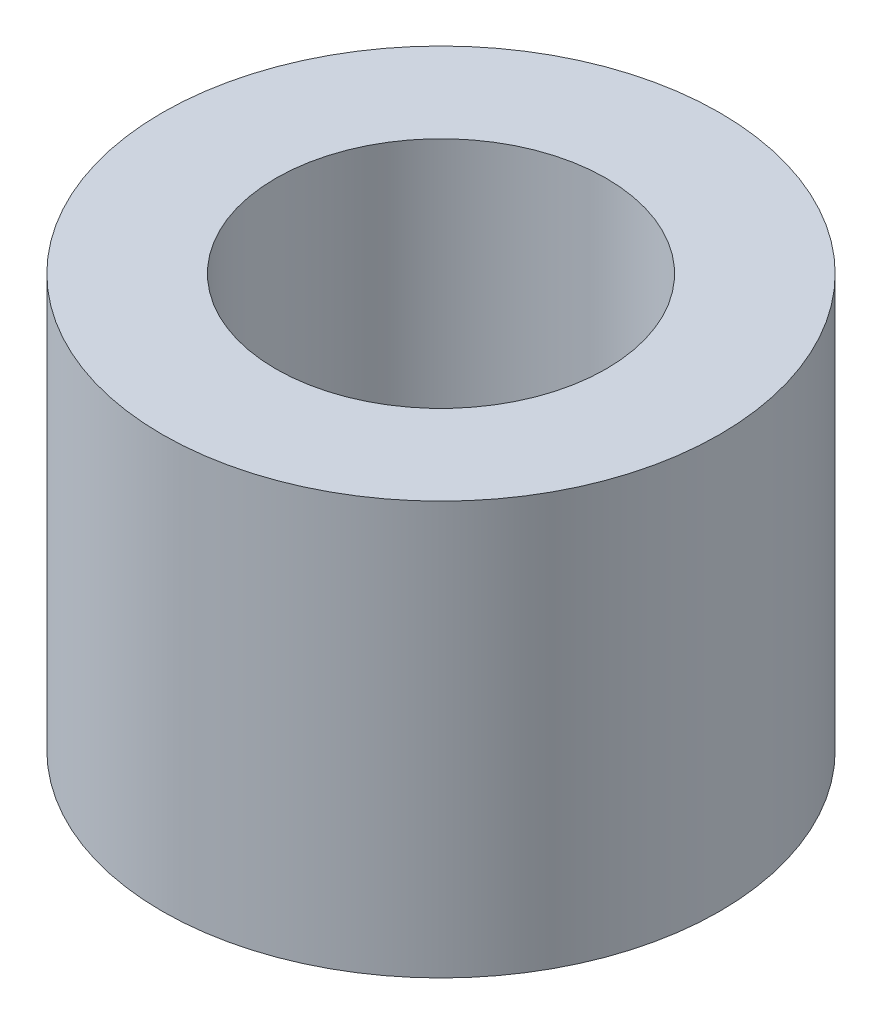
ISO-10303-21;
HEADER;
FILE_DESCRIPTION(('STEP AP214'),'2;1');
FILE_NAME('part.step','',(''),(''),'','','');
FILE_SCHEMA(('AUTOMOTIVE_DESIGN { 1 0 10303 214 1 1 1 1 }'));
ENDSEC;
DATA;
#1=APPLICATION_CONTEXT('core data for automotive mechanical design processes');
#2=APPLICATION_PROTOCOL_DEFINITION('international standard','automotive_design',2000,#1);
#3=PRODUCT_CONTEXT('',#1,'mechanical');
#4=PRODUCT('Part','Part','',(#3));
#5=PRODUCT_RELATED_PRODUCT_CATEGORY('part','',(#4));
#6=PRODUCT_DEFINITION_FORMATION('','',#4);
#7=PRODUCT_DEFINITION_CONTEXT('part definition',#1,'design');
#8=PRODUCT_DEFINITION('design','',#6,#7);
#9=PRODUCT_DEFINITION_SHAPE('','',#8);
#10=(LENGTH_UNIT() NAMED_UNIT(*) SI_UNIT(.MILLI.,.METRE.));
#11=(NAMED_UNIT(*) PLANE_ANGLE_UNIT() SI_UNIT($,.RADIAN.));
#12=(NAMED_UNIT(*) SI_UNIT($,.STERADIAN.) SOLID_ANGLE_UNIT());
#13=UNCERTAINTY_MEASURE_WITH_UNIT(LENGTH_MEASURE(1.E-05),#10,'distance_accuracy_value','');
#14=(GEOMETRIC_REPRESENTATION_CONTEXT(3) GLOBAL_UNCERTAINTY_ASSIGNED_CONTEXT((#13)) GLOBAL_UNIT_ASSIGNED_CONTEXT((#10,
#11,#12)) REPRESENTATION_CONTEXT('',''));
#15=CARTESIAN_POINT('',(0.,0.,0.));
#16=DIRECTION('',(0.,0.,1.));
#17=DIRECTION('',(1.,0.,0.));
#18=AXIS2_PLACEMENT_3D('',#15,#16,#17);
#19=CARTESIAN_POINT('',(0.,4.,0.));
#20=DIRECTION('',(0.,1.,0.));
#21=DIRECTION('',(0.,0.,1.));
#22=AXIS2_PLACEMENT_3D('',#19,#20,#21);
#23=PLANE('',#22);
#24=CARTESIAN_POINT('',(0.,4.,0.));
#25=DIRECTION('',(0.,1.,0.));
#26=DIRECTION('',(0.,0.,1.));
#27=AXIS2_PLACEMENT_3D('',#24,#25,#26);
#28=CIRCLE('',#27,2.7);
#29=CARTESIAN_POINT('',(0.,4.,2.7));
#30=VERTEX_POINT('',#29);
#31=EDGE_CURVE('E10',#30,#30,#28,.T.);
#32=ORIENTED_EDGE('',*,*,#31,.T.);
#33=EDGE_LOOP('',(#32));
#34=FACE_BOUND('',#33,.T.);
#35=CARTESIAN_POINT('',(0.,4.,0.));
#36=DIRECTION('',(0.,1.,0.));
#37=DIRECTION('',(0.,0.,1.));
#38=AXIS2_PLACEMENT_3D('',#35,#36,#37);
#39=CIRCLE('',#38,1.6);
#40=CARTESIAN_POINT('',(0.,4.,1.6));
#41=VERTEX_POINT('',#40);
#42=EDGE_CURVE('E47',#41,#41,#39,.T.);
#43=ORIENTED_EDGE('',*,*,#42,.F.);
#44=EDGE_LOOP('',(#43));
#45=FACE_BOUND('',#44,.T.);
#46=ADVANCED_FACE('F36',(#34,#45),#23,.T.);
#47=CARTESIAN_POINT('',(0.,0.,0.));
#48=DIRECTION('',(0.,1.,0.));
#49=DIRECTION('',(0.,0.,1.));
#50=AXIS2_PLACEMENT_3D('',#47,#48,#49);
#51=PLANE('',#50);
#52=CARTESIAN_POINT('',(0.,0.,0.));
#53=DIRECTION('',(0.,1.,0.));
#54=DIRECTION('',(0.,0.,1.));
#55=AXIS2_PLACEMENT_3D('',#52,#53,#54);
#56=CIRCLE('',#55,2.7);
#57=CARTESIAN_POINT('',(0.,0.,2.7));
#58=VERTEX_POINT('',#57);
#59=EDGE_CURVE('E40',#58,#58,#56,.T.);
#60=ORIENTED_EDGE('',*,*,#59,.F.);
#61=EDGE_LOOP('',(#60));
#62=FACE_BOUND('',#61,.T.);
#63=CARTESIAN_POINT('',(0.,0.,0.));
#64=DIRECTION('',(0.,1.,0.));
#65=DIRECTION('',(0.,0.,1.));
#66=AXIS2_PLACEMENT_3D('',#63,#64,#65);
#67=CIRCLE('',#66,1.6);
#68=CARTESIAN_POINT('',(0.,0.,1.6));
#69=VERTEX_POINT('',#68);
#70=EDGE_CURVE('E49',#69,#69,#67,.T.);
#71=ORIENTED_EDGE('',*,*,#70,.T.);
#72=EDGE_LOOP('',(#71));
#73=FACE_BOUND('',#72,.T.);
#74=ADVANCED_FACE('F59',(#62,#73),#51,.F.);
#75=CARTESIAN_POINT('',(0.,4.,0.));
#76=DIRECTION('',(0.,-1.,0.));
#77=DIRECTION('',(0.,0.,-1.));
#78=AXIS2_PLACEMENT_3D('',#75,#76,#77);
#79=CYLINDRICAL_SURFACE('',#78,2.7);
#80=ORIENTED_EDGE('',*,*,#31,.F.);
#81=EDGE_LOOP('',(#80));
#82=FACE_BOUND('',#81,.T.);
#83=ORIENTED_EDGE('',*,*,#59,.T.);
#84=EDGE_LOOP('',(#83));
#85=FACE_BOUND('',#84,.T.);
#86=ADVANCED_FACE('F38',(#82,#85),#79,.T.);
#87=CARTESIAN_POINT('',(0.,4.,0.));
#88=DIRECTION('',(0.,-1.,0.));
#89=DIRECTION('',(0.,0.,-1.));
#90=AXIS2_PLACEMENT_3D('',#87,#88,#89);
#91=CYLINDRICAL_SURFACE('',#90,1.6);
#92=ORIENTED_EDGE('',*,*,#42,.T.);
#93=EDGE_LOOP('',(#92));
#94=FACE_BOUND('',#93,.T.);
#95=ORIENTED_EDGE('',*,*,#70,.F.);
#96=EDGE_LOOP('',(#95));
#97=FACE_BOUND('',#96,.T.);
#98=ADVANCED_FACE('F55',(#94,#97),#91,.F.);
#99=CLOSED_SHELL('',(#46,#74,#86,#98));
#100=MANIFOLD_SOLID_BREP('B2',#99);
#101=ADVANCED_BREP_SHAPE_REPRESENTATION('',(#18,#100),#14);
#102=SHAPE_DEFINITION_REPRESENTATION(#9,#101);
ENDSEC;
END-ISO-10303-21;
